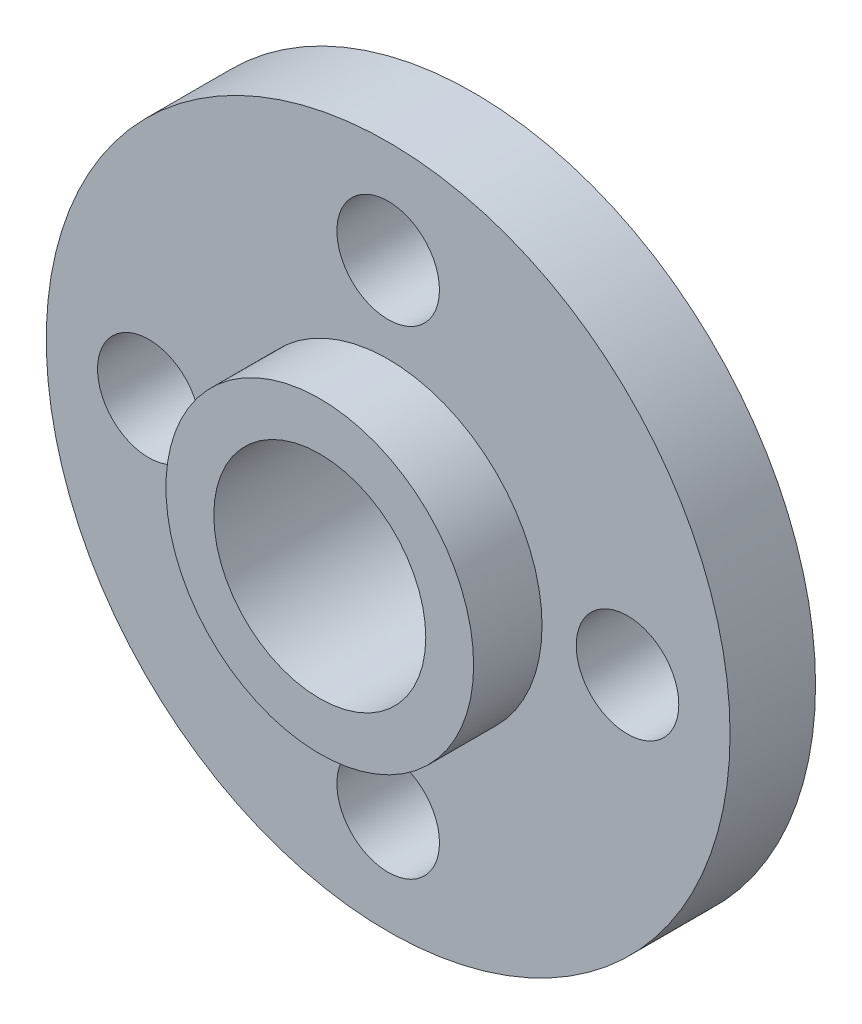
ISO-10303-21;
HEADER;
FILE_DESCRIPTION(('STEP AP214'),'2;1');
FILE_NAME('part.step','',(''),(''),'','','');
FILE_SCHEMA(('AUTOMOTIVE_DESIGN { 1 0 10303 214 1 1 1 1 }'));
ENDSEC;
DATA;
#1=APPLICATION_CONTEXT('core data for automotive mechanical design processes');
#2=APPLICATION_PROTOCOL_DEFINITION('international standard','automotive_design',2000,#1);
#3=PRODUCT_CONTEXT('',#1,'mechanical');
#4=PRODUCT('Part','Part','',(#3));
#5=PRODUCT_RELATED_PRODUCT_CATEGORY('part','',(#4));
#6=PRODUCT_DEFINITION_FORMATION('','',#4);
#7=PRODUCT_DEFINITION_CONTEXT('part definition',#1,'design');
#8=PRODUCT_DEFINITION('design','',#6,#7);
#9=PRODUCT_DEFINITION_SHAPE('','',#8);
#10=(LENGTH_UNIT() NAMED_UNIT(*) SI_UNIT(.MILLI.,.METRE.));
#11=(NAMED_UNIT(*) PLANE_ANGLE_UNIT() SI_UNIT($,.RADIAN.));
#12=(NAMED_UNIT(*) SI_UNIT($,.STERADIAN.) SOLID_ANGLE_UNIT());
#13=UNCERTAINTY_MEASURE_WITH_UNIT(LENGTH_MEASURE(1.E-05),#10,'distance_accuracy_value','');
#14=(GEOMETRIC_REPRESENTATION_CONTEXT(3) GLOBAL_UNCERTAINTY_ASSIGNED_CONTEXT((#13)) GLOBAL_UNIT_ASSIGNED_CONTEXT((#10,
#11,#12)) REPRESENTATION_CONTEXT('',''));
#15=CARTESIAN_POINT('',(0.,0.,0.));
#16=DIRECTION('',(0.,0.,1.));
#17=DIRECTION('',(1.,0.,0.));
#18=AXIS2_PLACEMENT_3D('',#15,#16,#17);
#19=CARTESIAN_POINT('',(0.,0.,2.5));
#20=DIRECTION('',(0.,0.,1.));
#21=DIRECTION('',(1.,0.,0.));
#22=AXIS2_PLACEMENT_3D('',#19,#20,#21);
#23=PLANE('',#22);
#24=CARTESIAN_POINT('',(-7.,0.,2.5));
#25=DIRECTION('',(0.,0.,1.));
#26=DIRECTION('',(1.,0.,0.));
#27=AXIS2_PLACEMENT_3D('',#24,#25,#26);
#28=CIRCLE('',#27,1.5);
#29=CARTESIAN_POINT('',(-5.5,0.,2.5));
#30=VERTEX_POINT('',#29);
#31=EDGE_CURVE('E80',#30,#30,#28,.T.);
#32=ORIENTED_EDGE('',*,*,#31,.F.);
#33=EDGE_LOOP('',(#32));
#34=FACE_BOUND('',#33,.T.);
#35=CARTESIAN_POINT('',(7.,0.,2.5));
#36=DIRECTION('',(0.,0.,1.));
#37=DIRECTION('',(1.,0.,0.));
#38=AXIS2_PLACEMENT_3D('',#35,#36,#37);
#39=CIRCLE('',#38,1.5);
#40=CARTESIAN_POINT('',(8.5,0.,2.5));
#41=VERTEX_POINT('',#40);
#42=EDGE_CURVE('E67',#41,#41,#39,.T.);
#43=ORIENTED_EDGE('',*,*,#42,.F.);
#44=EDGE_LOOP('',(#43));
#45=FACE_BOUND('',#44,.T.);
#46=CARTESIAN_POINT('',(0.,7.,2.5));
#47=DIRECTION('',(0.,0.,1.));
#48=DIRECTION('',(1.,0.,0.));
#49=AXIS2_PLACEMENT_3D('',#46,#47,#48);
#50=CIRCLE('',#49,1.5);
#51=CARTESIAN_POINT('',(1.5,7.,2.5));
#52=VERTEX_POINT('',#51);
#53=EDGE_CURVE('E54',#52,#52,#50,.T.);
#54=ORIENTED_EDGE('',*,*,#53,.F.);
#55=EDGE_LOOP('',(#54));
#56=FACE_BOUND('',#55,.T.);
#57=CARTESIAN_POINT('',(0.,0.,2.5));
#58=DIRECTION('',(0.,0.,1.));
#59=DIRECTION('',(1.,0.,0.));
#60=AXIS2_PLACEMENT_3D('',#57,#58,#59);
#61=CIRCLE('',#60,10.);
#62=CARTESIAN_POINT('',(10.,0.,2.5));
#63=VERTEX_POINT('',#62);
#64=EDGE_CURVE('E10',#63,#63,#61,.T.);
#65=ORIENTED_EDGE('',*,*,#64,.T.);
#66=EDGE_LOOP('',(#65));
#67=FACE_BOUND('',#66,.T.);
#68=CARTESIAN_POINT('',(1.96380207734619E-13,-7.,2.5));
#69=DIRECTION('',(0.,0.,1.));
#70=DIRECTION('',(1.,0.,0.));
#71=AXIS2_PLACEMENT_3D('',#68,#69,#70);
#72=CIRCLE('',#71,1.50000000000023);
#73=CARTESIAN_POINT('',(1.50000000000043,-7.,2.5));
#74=VERTEX_POINT('',#73);
#75=EDGE_CURVE('E72',#74,#74,#72,.T.);
#76=ORIENTED_EDGE('',*,*,#75,.F.);
#77=EDGE_LOOP('',(#76));
#78=FACE_BOUND('',#77,.T.);
#79=CARTESIAN_POINT('',(0.,0.,2.5));
#80=DIRECTION('',(0.,0.,1.));
#81=DIRECTION('',(1.,0.,0.));
#82=AXIS2_PLACEMENT_3D('',#79,#80,#81);
#83=CIRCLE('',#82,4.5);
#84=CARTESIAN_POINT('',(4.5,0.,2.5));
#85=VERTEX_POINT('',#84);
#86=EDGE_CURVE('E92',#85,#85,#83,.T.);
#87=ORIENTED_EDGE('',*,*,#86,.F.);
#88=EDGE_LOOP('',(#87));
#89=FACE_BOUND('',#88,.T.);
#90=ADVANCED_FACE('F41',(#34,#45,#56,#67,#78,#89),#23,.T.);
#91=CARTESIAN_POINT('',(0.,0.,0.));
#92=DIRECTION('',(0.,0.,1.));
#93=DIRECTION('',(1.,0.,0.));
#94=AXIS2_PLACEMENT_3D('',#91,#92,#93);
#95=PLANE('',#94);
#96=CARTESIAN_POINT('',(0.,0.,0.));
#97=DIRECTION('',(0.,0.,1.));
#98=DIRECTION('',(1.,0.,0.));
#99=AXIS2_PLACEMENT_3D('',#96,#97,#98);
#100=CIRCLE('',#99,10.);
#101=CARTESIAN_POINT('',(10.,0.,0.));
#102=VERTEX_POINT('',#101);
#103=EDGE_CURVE('E45',#102,#102,#100,.T.);
#104=ORIENTED_EDGE('',*,*,#103,.F.);
#105=EDGE_LOOP('',(#104));
#106=FACE_BOUND('',#105,.T.);
#107=CARTESIAN_POINT('',(0.,7.,0.));
#108=DIRECTION('',(0.,0.,1.));
#109=DIRECTION('',(1.,0.,0.));
#110=AXIS2_PLACEMENT_3D('',#107,#108,#109);
#111=CIRCLE('',#110,1.5);
#112=CARTESIAN_POINT('',(1.5,7.,0.));
#113=VERTEX_POINT('',#112);
#114=EDGE_CURVE('E56',#113,#113,#111,.T.);
#115=ORIENTED_EDGE('',*,*,#114,.T.);
#116=EDGE_LOOP('',(#115));
#117=FACE_BOUND('',#116,.T.);
#118=CARTESIAN_POINT('',(0.,0.,0.));
#119=DIRECTION('',(0.,0.,1.));
#120=DIRECTION('',(1.,0.,0.));
#121=AXIS2_PLACEMENT_3D('',#118,#119,#120);
#122=CIRCLE('',#121,3.1);
#123=CARTESIAN_POINT('',(3.1,0.,0.));
#124=VERTEX_POINT('',#123);
#125=EDGE_CURVE('E60',#124,#124,#122,.T.);
#126=ORIENTED_EDGE('',*,*,#125,.T.);
#127=EDGE_LOOP('',(#126));
#128=FACE_BOUND('',#127,.T.);
#129=CARTESIAN_POINT('',(7.,0.,0.));
#130=DIRECTION('',(0.,0.,1.));
#131=DIRECTION('',(1.,0.,0.));
#132=AXIS2_PLACEMENT_3D('',#129,#130,#131);
#133=CIRCLE('',#132,1.5);
#134=CARTESIAN_POINT('',(8.5,0.,0.));
#135=VERTEX_POINT('',#134);
#136=EDGE_CURVE('E68',#135,#135,#133,.T.);
#137=ORIENTED_EDGE('',*,*,#136,.T.);
#138=EDGE_LOOP('',(#137));
#139=FACE_BOUND('',#138,.T.);
#140=CARTESIAN_POINT('',(1.96380207734619E-13,-7.,0.));
#141=DIRECTION('',(0.,0.,1.));
#142=DIRECTION('',(1.,0.,0.));
#143=AXIS2_PLACEMENT_3D('',#140,#141,#142);
#144=CIRCLE('',#143,1.50000000000023);
#145=CARTESIAN_POINT('',(1.50000000000043,-7.,0.));
#146=VERTEX_POINT('',#145);
#147=EDGE_CURVE('E76',#146,#146,#144,.T.);
#148=ORIENTED_EDGE('',*,*,#147,.T.);
#149=EDGE_LOOP('',(#148));
#150=FACE_BOUND('',#149,.T.);
#151=CARTESIAN_POINT('',(-7.,0.,0.));
#152=DIRECTION('',(0.,0.,1.));
#153=DIRECTION('',(1.,0.,0.));
#154=AXIS2_PLACEMENT_3D('',#151,#152,#153);
#155=CIRCLE('',#154,1.5);
#156=CARTESIAN_POINT('',(-5.5,0.,0.));
#157=VERTEX_POINT('',#156);
#158=EDGE_CURVE('E84',#157,#157,#155,.T.);
#159=ORIENTED_EDGE('',*,*,#158,.T.);
#160=EDGE_LOOP('',(#159));
#161=FACE_BOUND('',#160,.T.);
#162=ADVANCED_FACE('F122',(#106,#117,#128,#139,#150,#161),#95,.F.);
#163=CARTESIAN_POINT('',(0.,0.,2.5));
#164=DIRECTION('',(0.,0.,-1.));
#165=DIRECTION('',(-1.,0.,0.));
#166=AXIS2_PLACEMENT_3D('',#163,#164,#165);
#167=CYLINDRICAL_SURFACE('',#166,10.);
#168=ORIENTED_EDGE('',*,*,#64,.F.);
#169=EDGE_LOOP('',(#168));
#170=FACE_BOUND('',#169,.T.);
#171=ORIENTED_EDGE('',*,*,#103,.T.);
#172=EDGE_LOOP('',(#171));
#173=FACE_BOUND('',#172,.T.);
#174=ADVANCED_FACE('F43',(#170,#173),#167,.T.);
#175=CARTESIAN_POINT('',(0.,7.,2.5));
#176=DIRECTION('',(0.,0.,-1.));
#177=DIRECTION('',(-1.,0.,0.));
#178=AXIS2_PLACEMENT_3D('',#175,#176,#177);
#179=CYLINDRICAL_SURFACE('',#178,1.5);
#180=ORIENTED_EDGE('',*,*,#53,.T.);
#181=EDGE_LOOP('',(#180));
#182=FACE_BOUND('',#181,.T.);
#183=ORIENTED_EDGE('',*,*,#114,.F.);
#184=EDGE_LOOP('',(#183));
#185=FACE_BOUND('',#184,.T.);
#186=ADVANCED_FACE('F132',(#182,#185),#179,.F.);
#187=CARTESIAN_POINT('',(0.,0.,2.5));
#188=DIRECTION('',(0.,0.,-1.));
#189=DIRECTION('',(-1.,0.,0.));
#190=AXIS2_PLACEMENT_3D('',#187,#188,#189);
#191=CYLINDRICAL_SURFACE('',#190,3.1);
#192=ORIENTED_EDGE('',*,*,#125,.F.);
#193=EDGE_LOOP('',(#192));
#194=FACE_BOUND('',#193,.T.);
#195=CARTESIAN_POINT('',(0.,0.,4.5));
#196=DIRECTION('',(0.,0.,1.));
#197=DIRECTION('',(1.,0.,0.));
#198=AXIS2_PLACEMENT_3D('',#195,#196,#197);
#199=CIRCLE('',#198,3.1);
#200=CARTESIAN_POINT('',(3.1,0.,4.5));
#201=VERTEX_POINT('',#200);
#202=EDGE_CURVE('E96',#201,#201,#199,.T.);
#203=ORIENTED_EDGE('',*,*,#202,.T.);
#204=EDGE_LOOP('',(#203));
#205=FACE_BOUND('',#204,.T.);
#206=ADVANCED_FACE('F104',(#194,#205),#191,.F.);
#207=CARTESIAN_POINT('',(7.,0.,2.5));
#208=DIRECTION('',(0.,0.,-1.));
#209=DIRECTION('',(-1.,0.,0.));
#210=AXIS2_PLACEMENT_3D('',#207,#208,#209);
#211=CYLINDRICAL_SURFACE('',#210,1.5);
#212=ORIENTED_EDGE('',*,*,#42,.T.);
#213=EDGE_LOOP('',(#212));
#214=FACE_BOUND('',#213,.T.);
#215=ORIENTED_EDGE('',*,*,#136,.F.);
#216=EDGE_LOOP('',(#215));
#217=FACE_BOUND('',#216,.T.);
#218=ADVANCED_FACE('F138',(#214,#217),#211,.F.);
#219=CARTESIAN_POINT('',(1.96380207734619E-13,-7.,2.5));
#220=DIRECTION('',(0.,0.,-1.));
#221=DIRECTION('',(-1.,0.,0.));
#222=AXIS2_PLACEMENT_3D('',#219,#220,#221);
#223=CYLINDRICAL_SURFACE('',#222,1.50000000000023);
#224=ORIENTED_EDGE('',*,*,#75,.T.);
#225=EDGE_LOOP('',(#224));
#226=FACE_BOUND('',#225,.T.);
#227=ORIENTED_EDGE('',*,*,#147,.F.);
#228=EDGE_LOOP('',(#227));
#229=FACE_BOUND('',#228,.T.);
#230=ADVANCED_FACE('F118',(#226,#229),#223,.F.);
#231=CARTESIAN_POINT('',(-7.,0.,2.5));
#232=DIRECTION('',(0.,0.,-1.));
#233=DIRECTION('',(-1.,0.,0.));
#234=AXIS2_PLACEMENT_3D('',#231,#232,#233);
#235=CYLINDRICAL_SURFACE('',#234,1.5);
#236=ORIENTED_EDGE('',*,*,#31,.T.);
#237=EDGE_LOOP('',(#236));
#238=FACE_BOUND('',#237,.T.);
#239=ORIENTED_EDGE('',*,*,#158,.F.);
#240=EDGE_LOOP('',(#239));
#241=FACE_BOUND('',#240,.T.);
#242=ADVANCED_FACE('F109',(#238,#241),#235,.F.);
#243=CARTESIAN_POINT('',(0.,0.,4.5));
#244=DIRECTION('',(0.,0.,1.));
#245=DIRECTION('',(1.,0.,0.));
#246=AXIS2_PLACEMENT_3D('',#243,#244,#245);
#247=PLANE('',#246);
#248=CARTESIAN_POINT('',(0.,0.,4.5));
#249=DIRECTION('',(0.,0.,1.));
#250=DIRECTION('',(1.,0.,0.));
#251=AXIS2_PLACEMENT_3D('',#248,#249,#250);
#252=CIRCLE('',#251,4.5);
#253=CARTESIAN_POINT('',(4.5,0.,4.5));
#254=VERTEX_POINT('',#253);
#255=EDGE_CURVE('E88',#254,#254,#252,.T.);
#256=ORIENTED_EDGE('',*,*,#255,.T.);
#257=EDGE_LOOP('',(#256));
#258=FACE_BOUND('',#257,.T.);
#259=ORIENTED_EDGE('',*,*,#202,.F.);
#260=EDGE_LOOP('',(#259));
#261=FACE_BOUND('',#260,.T.);
#262=ADVANCED_FACE('F106',(#258,#261),#247,.T.);
#263=CARTESIAN_POINT('',(0.,0.,4.5));
#264=DIRECTION('',(0.,0.,-1.));
#265=DIRECTION('',(-1.,0.,0.));
#266=AXIS2_PLACEMENT_3D('',#263,#264,#265);
#267=CYLINDRICAL_SURFACE('',#266,4.5);
#268=ORIENTED_EDGE('',*,*,#255,.F.);
#269=EDGE_LOOP('',(#268));
#270=FACE_BOUND('',#269,.T.);
#271=ORIENTED_EDGE('',*,*,#86,.T.);
#272=EDGE_LOOP('',(#271));
#273=FACE_BOUND('',#272,.T.);
#274=ADVANCED_FACE('F108',(#270,#273),#267,.T.);
#275=CLOSED_SHELL('',(#90,#162,#174,#186,#206,#218,#230,#242,#262,#274));
#276=MANIFOLD_SOLID_BREP('B2',#275);
#277=ADVANCED_BREP_SHAPE_REPRESENTATION('',(#18,#276),#14);
#278=SHAPE_DEFINITION_REPRESENTATION(#9,#277);
ENDSEC;
END-ISO-10303-21;
